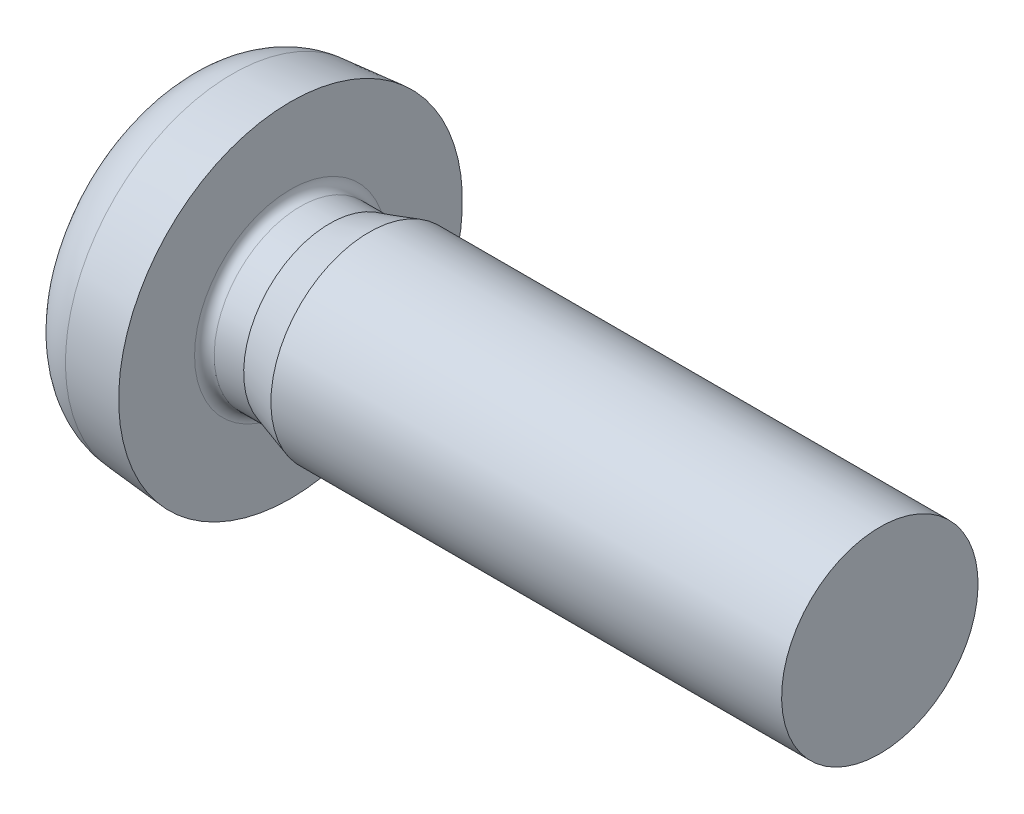
ISO-10303-21;
HEADER;
FILE_DESCRIPTION(('STEP AP214'),'2;1');
FILE_NAME('part.step','',(''),(''),'','','');
FILE_SCHEMA(('AUTOMOTIVE_DESIGN { 1 0 10303 214 1 1 1 1 }'));
ENDSEC;
DATA;
#1=APPLICATION_CONTEXT('core data for automotive mechanical design processes');
#2=APPLICATION_PROTOCOL_DEFINITION('international standard','automotive_design',2000,#1);
#3=PRODUCT_CONTEXT('',#1,'mechanical');
#4=PRODUCT('Part','Part','',(#3));
#5=PRODUCT_RELATED_PRODUCT_CATEGORY('part','',(#4));
#6=PRODUCT_DEFINITION_FORMATION('','',#4);
#7=PRODUCT_DEFINITION_CONTEXT('part definition',#1,'design');
#8=PRODUCT_DEFINITION('design','',#6,#7);
#9=PRODUCT_DEFINITION_SHAPE('','',#8);
#10=(LENGTH_UNIT() NAMED_UNIT(*) SI_UNIT(.MILLI.,.METRE.));
#11=(NAMED_UNIT(*) PLANE_ANGLE_UNIT() SI_UNIT($,.RADIAN.));
#12=(NAMED_UNIT(*) SI_UNIT($,.STERADIAN.) SOLID_ANGLE_UNIT());
#13=UNCERTAINTY_MEASURE_WITH_UNIT(LENGTH_MEASURE(1.E-05),#10,'distance_accuracy_value','');
#14=(GEOMETRIC_REPRESENTATION_CONTEXT(3) GLOBAL_UNCERTAINTY_ASSIGNED_CONTEXT((#13)) GLOBAL_UNIT_ASSIGNED_CONTEXT((#10,
#11,#12)) REPRESENTATION_CONTEXT('',''));
#15=CARTESIAN_POINT('',(0.,0.,0.));
#16=DIRECTION('',(0.,0.,1.));
#17=DIRECTION('',(1.,0.,0.));
#18=AXIS2_PLACEMENT_3D('',#15,#16,#17);
#19=CARTESIAN_POINT('',(-0.3,0.4,-0.23333333333333));
#20=DIRECTION('',(-1.,0.,0.));
#21=DIRECTION('',(0.,0.,1.));
#22=AXIS2_PLACEMENT_3D('',#19,#20,#21);
#23=PLANE('',#22);
#24=CARTESIAN_POINT('',(-0.3,0.,0.));
#25=DIRECTION('',(-1.,0.,0.));
#26=DIRECTION('',(0.,0.,1.));
#27=AXIS2_PLACEMENT_3D('',#24,#25,#26);
#28=CIRCLE('',#27,0.41489922506576);
#29=CARTESIAN_POINT('',(-0.300000000000007,0.110187871202621,0.400000000000005));
#30=VERTEX_POINT('',#29);
#31=CARTESIAN_POINT('',(-0.3,0.233333333333331,0.343069850782206));
#32=VERTEX_POINT('',#31);
#33=EDGE_CURVE('E434',#30,#32,#28,.T.);
#34=ORIENTED_EDGE('',*,*,#33,.F.);
#35=CARTESIAN_POINT('',(-0.299999999999999,0.233333333333331,0.400000000000001));
#36=DIRECTION('',(0.,-1.,0.));
#37=VECTOR('',#36,1.);
#38=LINE('',#35,#37);
#39=CARTESIAN_POINT('',(-0.3,0.233333333333332,0.4));
#40=VERTEX_POINT('',#39);
#41=EDGE_CURVE('E436',#40,#30,#38,.T.);
#42=ORIENTED_EDGE('',*,*,#41,.F.);
#43=CARTESIAN_POINT('',(-0.3,0.233333333333331,0.34306985078241));
#44=DIRECTION('',(0.,0.,1.));
#45=VECTOR('',#44,1.);
#46=LINE('',#43,#45);
#47=EDGE_CURVE('E437',#32,#40,#46,.T.);
#48=ORIENTED_EDGE('',*,*,#47,.F.);
#49=EDGE_LOOP('',(#34,#42,#48));
#50=FACE_BOUND('',#49,.T.);
#51=ADVANCED_FACE('F17',(#50),#23,.T.);
#52=CARTESIAN_POINT('',(-0.300000000000013,0.343069850782208,0.23333333333333));
#53=VERTEX_POINT('',#52);
#54=CARTESIAN_POINT('',(-0.3,0.400000000038284,0.11018787106366));
#55=VERTEX_POINT('',#54);
#56=EDGE_CURVE('E641',#53,#55,#28,.T.);
#57=ORIENTED_EDGE('',*,*,#56,.F.);
#58=CARTESIAN_POINT('',(-0.3,0.4,0.23333333333333));
#59=DIRECTION('',(0.,-1.,0.));
#60=VECTOR('',#59,1.);
#61=LINE('',#58,#60);
#62=CARTESIAN_POINT('',(-0.3,0.4,0.23333333333333));
#63=VERTEX_POINT('',#62);
#64=EDGE_CURVE('E533',#63,#53,#61,.T.);
#65=ORIENTED_EDGE('',*,*,#64,.F.);
#66=CARTESIAN_POINT('',(-0.300000000000001,0.400000000000001,0.110187871053114));
#67=DIRECTION('',(0.,0.,1.));
#68=VECTOR('',#67,1.);
#69=LINE('',#66,#68);
#70=EDGE_CURVE('E548',#55,#63,#69,.T.);
#71=ORIENTED_EDGE('',*,*,#70,.F.);
#72=EDGE_LOOP('',(#57,#65,#71));
#73=FACE_BOUND('',#72,.T.);
#74=ADVANCED_FACE('F424',(#73),#23,.T.);
#75=CARTESIAN_POINT('',(-0.300000000037748,0.400000000026424,-0.110187871119148));
#76=VERTEX_POINT('',#75);
#77=CARTESIAN_POINT('',(-0.3,0.343069850782207,-0.23333333333333));
#78=VERTEX_POINT('',#77);
#79=EDGE_CURVE('E642',#76,#78,#28,.T.);
#80=ORIENTED_EDGE('',*,*,#79,.F.);
#81=CARTESIAN_POINT('',(-0.300000000000001,0.400000000000001,-0.23333333333333));
#82=DIRECTION('',(0.,0.,1.));
#83=VECTOR('',#82,1.);
#84=LINE('',#81,#83);
#85=CARTESIAN_POINT('',(-0.3,0.4,-0.23333333333333));
#86=VERTEX_POINT('',#85);
#87=EDGE_CURVE('E541',#86,#76,#84,.T.);
#88=ORIENTED_EDGE('',*,*,#87,.F.);
#89=CARTESIAN_POINT('',(-0.3,0.343069850782207,-0.23333333333333));
#90=DIRECTION('',(0.,1.,0.));
#91=VECTOR('',#90,1.);
#92=LINE('',#89,#91);
#93=EDGE_CURVE('E317',#78,#86,#92,.T.);
#94=ORIENTED_EDGE('',*,*,#93,.F.);
#95=EDGE_LOOP('',(#80,#88,#94));
#96=FACE_BOUND('',#95,.T.);
#97=ADVANCED_FACE('F430',(#96),#23,.T.);
#98=CARTESIAN_POINT('',(-0.3,0.233333333333329,-0.343069850782208));
#99=VERTEX_POINT('',#98);
#100=CARTESIAN_POINT('',(-0.3,0.110187871202632,-0.4));
#101=VERTEX_POINT('',#100);
#102=EDGE_CURVE('E654',#99,#101,#28,.T.);
#103=ORIENTED_EDGE('',*,*,#102,.F.);
#104=CARTESIAN_POINT('',(-0.3,0.233333333333329,-0.400000000000001));
#105=DIRECTION('',(0.,0.,1.));
#106=VECTOR('',#105,1.);
#107=LINE('',#104,#106);
#108=CARTESIAN_POINT('',(-0.3,0.233333333333329,-0.4));
#109=VERTEX_POINT('',#108);
#110=EDGE_CURVE('E472',#109,#99,#107,.T.);
#111=ORIENTED_EDGE('',*,*,#110,.F.);
#112=CARTESIAN_POINT('',(-0.300000000000001,0.110187871202633,-0.400000000000002));
#113=DIRECTION('',(0.,1.,0.));
#114=VECTOR('',#113,1.);
#115=LINE('',#112,#114);
#116=EDGE_CURVE('E176',#101,#109,#115,.T.);
#117=ORIENTED_EDGE('',*,*,#116,.F.);
#118=EDGE_LOOP('',(#103,#111,#117));
#119=FACE_BOUND('',#118,.T.);
#120=ADVANCED_FACE('F659',(#119),#23,.T.);
#121=CARTESIAN_POINT('',(-0.3,-0.110187871202431,-0.400000000000056));
#122=VERTEX_POINT('',#121);
#123=CARTESIAN_POINT('',(-0.30000000000002,-0.233333333333332,-0.343069850782208));
#124=VERTEX_POINT('',#123);
#125=EDGE_CURVE('E591',#122,#124,#28,.T.);
#126=ORIENTED_EDGE('',*,*,#125,.F.);
#127=CARTESIAN_POINT('',(-0.300000000000001,-0.233333333333331,-0.400000000000001));
#128=DIRECTION('',(0.,1.,0.));
#129=VECTOR('',#128,1.);
#130=LINE('',#127,#129);
#131=CARTESIAN_POINT('',(-0.3,-0.233333333333332,-0.4));
#132=VERTEX_POINT('',#131);
#133=EDGE_CURVE('E589',#132,#122,#130,.T.);
#134=ORIENTED_EDGE('',*,*,#133,.F.);
#135=CARTESIAN_POINT('',(-0.3,-0.233333333333331,-0.343069850782409));
#136=DIRECTION('',(0.,0.,-1.));
#137=VECTOR('',#136,1.);
#138=LINE('',#135,#137);
#139=EDGE_CURVE('E177',#124,#132,#138,.T.);
#140=ORIENTED_EDGE('',*,*,#139,.F.);
#141=EDGE_LOOP('',(#126,#134,#140));
#142=FACE_BOUND('',#141,.T.);
#143=ADVANCED_FACE('F590',(#142),#23,.T.);
#144=CARTESIAN_POINT('',(-0.3,-0.343069850782207,-0.23333333333333));
#145=VERTEX_POINT('',#144);
#146=CARTESIAN_POINT('',(-0.300000000000011,-0.400000000000008,-0.11018787120261));
#147=VERTEX_POINT('',#146);
#148=EDGE_CURVE('E638',#145,#147,#28,.T.);
#149=ORIENTED_EDGE('',*,*,#148,.F.);
#150=CARTESIAN_POINT('',(-0.3,-0.4,-0.23333333333333));
#151=DIRECTION('',(0.,1.,0.));
#152=VECTOR('',#151,1.);
#153=LINE('',#150,#152);
#154=CARTESIAN_POINT('',(-0.3,-0.4,-0.23333333333333));
#155=VERTEX_POINT('',#154);
#156=EDGE_CURVE('E553',#155,#145,#153,.T.);
#157=ORIENTED_EDGE('',*,*,#156,.F.);
#158=CARTESIAN_POINT('',(-0.300000000000001,-0.400000000000001,-0.110187871053114));
#159=DIRECTION('',(0.,0.,-1.));
#160=VECTOR('',#159,1.);
#161=LINE('',#158,#160);
#162=EDGE_CURVE('E529',#147,#155,#161,.T.);
#163=ORIENTED_EDGE('',*,*,#162,.F.);
#164=EDGE_LOOP('',(#149,#157,#163));
#165=FACE_BOUND('',#164,.T.);
#166=ADVANCED_FACE('F750',(#165),#23,.T.);
#167=CARTESIAN_POINT('',(-0.3,-0.400000000000057,0.11018787120243));
#168=VERTEX_POINT('',#167);
#169=CARTESIAN_POINT('',(-0.30000000000002,-0.343069850782209,0.23333333333333));
#170=VERTEX_POINT('',#169);
#171=EDGE_CURVE('E619',#168,#170,#28,.T.);
#172=ORIENTED_EDGE('',*,*,#171,.F.);
#173=CARTESIAN_POINT('',(-0.300000000000001,-0.400000000000001,0.23333333333333));
#174=DIRECTION('',(0.,0.,-1.));
#175=VECTOR('',#174,1.);
#176=LINE('',#173,#175);
#177=CARTESIAN_POINT('',(-0.3,-0.4,0.23333333333333));
#178=VERTEX_POINT('',#177);
#179=EDGE_CURVE('E525',#178,#168,#176,.T.);
#180=ORIENTED_EDGE('',*,*,#179,.F.);
#181=CARTESIAN_POINT('',(-0.3,-0.343069850782207,0.23333333333333));
#182=DIRECTION('',(0.,-1.,0.));
#183=VECTOR('',#182,1.);
#184=LINE('',#181,#183);
#185=EDGE_CURVE('E535',#170,#178,#184,.T.);
#186=ORIENTED_EDGE('',*,*,#185,.F.);
#187=EDGE_LOOP('',(#172,#180,#186));
#188=FACE_BOUND('',#187,.T.);
#189=ADVANCED_FACE('F342',(#188),#23,.T.);
#190=CARTESIAN_POINT('',(0.271428571428572,0.,0.23333333333333));
#191=DIRECTION('',(0.,0.,1.));
#192=DIRECTION('',(1.,0.,0.));
#193=AXIS2_PLACEMENT_3D('',#190,#191,#192);
#194=PLANE('',#193);
#195=ORIENTED_EDGE('',*,*,#64,.T.);
#196=CARTESIAN_POINT('',(-0.2997,0.343038108403994,0.23333333333333));
#197=CARTESIAN_POINT('',(-0.426200518487948,0.356413169292468,0.23333333333333));
#198=CARTESIAN_POINT('',(-0.552724537571043,0.369562838851567,0.23333333333333));
#199=CARTESIAN_POINT('',(-0.805808804996358,0.395504275504335,0.23333333333333));
#200=CARTESIAN_POINT('',(-0.932369053194846,0.408296043998559,0.23333333333333));
#201=CARTESIAN_POINT('',(-1.13532721935039,0.428595006281568,0.23333333333333));
#202=CARTESIAN_POINT('',(-1.21171672944914,0.436186419234913,0.23333333333333));
#203=CARTESIAN_POINT('',(-1.28810992623331,0.44373980396504,0.23333333333333));
#204=B_SPLINE_CURVE_WITH_KNOTS('',3,(#196,#197,#198,#199,#200,#201,#202,#203),.UNSPECIFIED.,.F.,
.F.,(4,2,2,4),(0.,0.381616218749478,0.763230943932751,0.993528205938742),.UNSPECIFIED.);
#205=CARTESIAN_POINT('',(-1.27214147961395,0.442160764736997,0.23333333333333));
#206=VERTEX_POINT('',#205);
#207=EDGE_CURVE('E649',#53,#206,#204,.T.);
#208=ORIENTED_EDGE('',*,*,#207,.T.);
#209=CARTESIAN_POINT('',(3.19999999999751,0.,0.23333333333333));
#210=DIRECTION('',(0.,0.,1.));
#211=DIRECTION('',(1.,0.,0.));
#212=AXIS2_PLACEMENT_3D('',#209,#210,#211);
#213=CIRCLE('',#212,4.49394654569168);
#214=CARTESIAN_POINT('',(-1.17792712457823,1.01454898720476,0.23333333333333));
#215=VERTEX_POINT('',#214);
#216=EDGE_CURVE('E492',#215,#206,#213,.T.);
#217=ORIENTED_EDGE('',*,*,#216,.F.);
#218=DIRECTION('',(-0.81923192051904,0.573462344363328,0.));
#219=VECTOR('',#218,1.);
#220=CARTESIAN_POINT('',(-0.3,0.4,0.23333333333333));
#221=LINE('',#220,#219);
#222=EDGE_CURVE('E556',#63,#215,#221,.T.);
#223=ORIENTED_EDGE('',*,*,#222,.F.);
#224=EDGE_LOOP('',(#195,#208,#217,#223));
#225=FACE_BOUND('',#224,.T.);
#226=ADVANCED_FACE('F661',(#225),#194,.F.);
#227=CARTESIAN_POINT('',(0.271428571428572,0.,-0.23333333333333));
#228=DIRECTION('',(0.,0.,-1.));
#229=DIRECTION('',(-1.,0.,0.));
#230=AXIS2_PLACEMENT_3D('',#227,#228,#229);
#231=PLANE('',#230);
#232=CARTESIAN_POINT('',(3.19999999999751,0.,-0.23333333333333));
#233=DIRECTION('',(0.,0.,-1.));
#234=DIRECTION('',(-1.,0.,0.));
#235=AXIS2_PLACEMENT_3D('',#232,#233,#234);
#236=CIRCLE('',#235,4.49394654569168);
#237=CARTESIAN_POINT('',(-1.27214147961393,0.442160764737084,-0.23333333333333));
#238=VERTEX_POINT('',#237);
#239=CARTESIAN_POINT('',(-1.17792712457823,1.01454898720476,-0.23333333333333));
#240=VERTEX_POINT('',#239);
#241=EDGE_CURVE('E499',#238,#240,#236,.T.);
#242=ORIENTED_EDGE('',*,*,#241,.F.);
#243=CARTESIAN_POINT('',(-1.28810992623331,0.44373980396504,-0.23333333333333));
#244=CARTESIAN_POINT('',(-1.20571743140864,0.435594808395287,-0.23333333333333));
#245=CARTESIAN_POINT('',(-1.12332951598812,0.427403221854397,-0.23333333333333));
#246=CARTESIAN_POINT('',(-0.958565391565636,0.410905577220105,-0.23333333333333));
#247=CARTESIAN_POINT('',(-0.876189182530653,0.402599519456286,-0.23333333333333));
#248=CARTESIAN_POINT('',(-0.711450476951214,0.385851589291033,-0.23333333333333));
#249=CARTESIAN_POINT('',(-0.629087980417993,0.37740971677886,-0.23333333333333));
#250=CARTESIAN_POINT('',(-0.464380151721125,0.360357960412237,-0.23333333333333));
#251=CARTESIAN_POINT('',(-0.38203481960775,0.351748076072497,-0.23333333333333));
#252=CARTESIAN_POINT('',(-0.299699999999289,0.343038108411188,-0.23333333333333));
#253=B_SPLINE_CURVE_WITH_KNOTS('',3,(#243,#244,#245,#246,#247,#248,#249,#250,#251,#252),
.UNSPECIFIED.,.F.,.F.,(4,2,2,2,4),(0.,0.248382344578916,0.496763974168754,0.7451458062906,
0.99352835595135),.UNSPECIFIED.);
#254=EDGE_CURVE('E278',#238,#78,#253,.T.);
#255=ORIENTED_EDGE('',*,*,#254,.T.);
#256=ORIENTED_EDGE('',*,*,#93,.T.);
#257=DIRECTION('',(-0.81923192051904,0.573462344363328,0.));
#258=VECTOR('',#257,1.);
#259=CARTESIAN_POINT('',(-0.3,0.4,-0.23333333333333));
#260=LINE('',#259,#258);
#261=EDGE_CURVE('E557',#86,#240,#260,.T.);
#262=ORIENTED_EDGE('',*,*,#261,.T.);
#263=EDGE_LOOP('',(#242,#255,#256,#262));
#264=FACE_BOUND('',#263,.T.);
#265=ADVANCED_FACE('F289',(#264),#231,.F.);
#266=CARTESIAN_POINT('',(3.19999999999751,0.,0.));
#267=DIRECTION('',(-1.,0.,0.));
#268=DIRECTION('',(0.,1.,0.));
#269=AXIS2_PLACEMENT_3D('',#266,#267,#268);
#270=SPHERICAL_SURFACE('',#269,4.49999999999762);
#271=CARTESIAN_POINT('',(3.19999999999751,0.23333333333333,0.));
#272=DIRECTION('',(0.,1.,0.));
#273=DIRECTION('',(0.,0.,1.));
#274=AXIS2_PLACEMENT_3D('',#271,#272,#273);
#275=CIRCLE('',#274,4.49394654569168);
#276=CARTESIAN_POINT('',(-1.17792712457823,0.233333333333327,-1.01454898720476));
#277=VERTEX_POINT('',#276);
#278=CARTESIAN_POINT('',(-1.27214147961395,0.233333333333329,-0.442160764736998));
#279=VERTEX_POINT('',#278);
#280=EDGE_CURVE('E598',#277,#279,#275,.T.);
#281=ORIENTED_EDGE('',*,*,#280,.T.);
#282=CARTESIAN_POINT('',(-1.27214147961395,0.,0.));
#283=DIRECTION('',(1.,0.,0.));
#284=DIRECTION('',(0.,0.,-1.));
#285=AXIS2_PLACEMENT_3D('',#282,#283,#284);
#286=CIRCLE('',#285,0.499950583875296);
#287=EDGE_CURVE('E644',#279,#238,#286,.T.);
#288=ORIENTED_EDGE('',*,*,#287,.T.);
#289=ORIENTED_EDGE('',*,*,#241,.T.);
#290=CARTESIAN_POINT('',(2.23691275167617,-1.37583892617332,0.));
#291=DIRECTION('',(0.573462344363328,0.819231920519041,0.));
#292=DIRECTION('',(-0.81923192051904,0.573462344363328,0.));
#293=AXIS2_PLACEMENT_3D('',#290,#291,#292);
#294=CIRCLE('',#293,4.17486888432747);
#295=EDGE_CURVE('E489',#240,#215,#294,.T.);
#296=ORIENTED_EDGE('',*,*,#295,.T.);
#297=ORIENTED_EDGE('',*,*,#216,.T.);
#298=CARTESIAN_POINT('',(-1.27214147961393,0.233333333333332,0.442160764737084));
#299=VERTEX_POINT('',#298);
#300=EDGE_CURVE('E622',#206,#299,#286,.T.);
#301=ORIENTED_EDGE('',*,*,#300,.T.);
#302=CARTESIAN_POINT('',(-1.17792712457823,0.233333333333334,1.01454898720476));
#303=VERTEX_POINT('',#302);
#304=EDGE_CURVE('E602',#299,#303,#275,.T.);
#305=ORIENTED_EDGE('',*,*,#304,.T.);
#306=CARTESIAN_POINT('',(2.23691275167617,0.,-1.37583892617332));
#307=DIRECTION('',(0.573462344363328,0.,0.819231920519041));
#308=DIRECTION('',(0.819231920519041,0.,-0.573462344363328));
#309=AXIS2_PLACEMENT_3D('',#306,#307,#308);
#310=CIRCLE('',#309,4.17486888432747);
#311=CARTESIAN_POINT('',(-1.17792712457823,-0.233333333333327,1.01454898720476));
#312=VERTEX_POINT('',#311);
#313=EDGE_CURVE('E486',#303,#312,#310,.T.);
#314=ORIENTED_EDGE('',*,*,#313,.T.);
#315=CARTESIAN_POINT('',(3.19999999999751,-0.23333333333333,0.));
#316=DIRECTION('',(0.,-1.,0.));
#317=DIRECTION('',(0.,0.,-1.));
#318=AXIS2_PLACEMENT_3D('',#315,#316,#317);
#319=CIRCLE('',#318,4.49394654569168);
#320=CARTESIAN_POINT('',(-1.27214147961403,-0.233333333333329,0.442160764736266));
#321=VERTEX_POINT('',#320);
#322=EDGE_CURVE('E601',#312,#321,#319,.T.);
#323=ORIENTED_EDGE('',*,*,#322,.T.);
#324=CARTESIAN_POINT('',(-1.27214147961395,-0.442160764736998,0.23333333333333));
#325=VERTEX_POINT('',#324);
#326=EDGE_CURVE('E35',#321,#325,#286,.T.);
#327=ORIENTED_EDGE('',*,*,#326,.T.);
#328=CARTESIAN_POINT('',(-1.17792712457823,-1.01454898720476,0.23333333333333));
#329=VERTEX_POINT('',#328);
#330=EDGE_CURVE('E495',#325,#329,#213,.T.);
#331=ORIENTED_EDGE('',*,*,#330,.T.);
#332=CARTESIAN_POINT('',(2.23691275167617,1.37583892617332,0.));
#333=DIRECTION('',(0.573462344363328,-0.819231920519041,0.));
#334=DIRECTION('',(0.81923192051904,0.573462344363328,0.));
#335=AXIS2_PLACEMENT_3D('',#332,#333,#334);
#336=CIRCLE('',#335,4.17486888432747);
#337=CARTESIAN_POINT('',(-1.17792712457823,-1.01454898720476,-0.23333333333333));
#338=VERTEX_POINT('',#337);
#339=EDGE_CURVE('E500',#329,#338,#336,.T.);
#340=ORIENTED_EDGE('',*,*,#339,.T.);
#341=CARTESIAN_POINT('',(-1.27214147961393,-0.442160764737084,-0.23333333333333));
#342=VERTEX_POINT('',#341);
#343=EDGE_CURVE('E496',#338,#342,#236,.T.);
#344=ORIENTED_EDGE('',*,*,#343,.T.);
#345=CARTESIAN_POINT('',(-1.27214147961395,-0.233333333333332,-0.442160764736996));
#346=VERTEX_POINT('',#345);
#347=EDGE_CURVE('E600',#342,#346,#286,.T.);
#348=ORIENTED_EDGE('',*,*,#347,.T.);
#349=CARTESIAN_POINT('',(-1.17792712457823,-0.233333333333334,-1.01454898720476));
#350=VERTEX_POINT('',#349);
#351=EDGE_CURVE('E186',#346,#350,#319,.T.);
#352=ORIENTED_EDGE('',*,*,#351,.T.);
#353=CARTESIAN_POINT('',(2.23691275167617,0.,1.37583892617332));
#354=DIRECTION('',(0.573462344363329,0.,-0.819231920519041));
#355=DIRECTION('',(-0.819231920519041,0.,-0.573462344363329));
#356=AXIS2_PLACEMENT_3D('',#353,#354,#355);
#357=CIRCLE('',#356,4.17486888432747);
#358=EDGE_CURVE('E27',#350,#277,#357,.T.);
#359=ORIENTED_EDGE('',*,*,#358,.T.);
#360=EDGE_LOOP('',(#281,#288,#289,#296,#297,#301,#305,#314,#323,#327,#331,#340,#344,#348,#352,#359));
#361=FACE_BOUND('',#360,.T.);
#362=CARTESIAN_POINT('',(-1.1171858241993,0.,0.));
#363=DIRECTION('',(-1.,0.,0.));
#364=DIRECTION('',(0.,-1.,0.));
#365=AXIS2_PLACEMENT_3D('',#362,#363,#364);
#366=CIRCLE('',#365,1.2696088213827);
#367=CARTESIAN_POINT('',(-1.1171858241993,-1.2696088213827,0.));
#368=VERTEX_POINT('',#367);
#369=EDGE_CURVE('E503',#368,#368,#366,.T.);
#370=ORIENTED_EDGE('',*,*,#369,.T.);
#371=EDGE_LOOP('',(#370));
#372=FACE_BOUND('',#371,.T.);
#373=ADVANCED_FACE('F19',(#361,#372),#270,.T.);
#374=CARTESIAN_POINT('',(-0.541561047639255,0.,0.));
#375=DIRECTION('',(-1.,0.,0.));
#376=DIRECTION('',(0.,-1.,0.));
#377=AXIS2_PLACEMENT_3D('',#374,#375,#376);
#378=TOROIDAL_SURFACE('',#377,1.10032764519818,0.600000000000179);
#379=ORIENTED_EDGE('',*,*,#369,.F.);
#380=EDGE_LOOP('',(#379));
#381=FACE_BOUND('',#380,.T.);
#382=CARTESIAN_POINT('',(-0.593854493287836,0.,0.));
#383=DIRECTION('',(-1.,0.,0.));
#384=DIRECTION('',(0.,-1.,0.));
#385=AXIS2_PLACEMENT_3D('',#382,#383,#384);
#386=CIRCLE('',#385,1.69804446405341);
#387=CARTESIAN_POINT('',(-0.593854493287836,-1.69804446405342,0.));
#388=VERTEX_POINT('',#387);
#389=EDGE_CURVE('E506',#388,#388,#386,.T.);
#390=ORIENTED_EDGE('',*,*,#389,.T.);
#391=EDGE_LOOP('',(#390));
#392=FACE_BOUND('',#391,.T.);
#393=ADVANCED_FACE('F733',(#381,#392),#378,.T.);
#394=CARTESIAN_POINT('',(0.,0.,0.));
#395=DIRECTION('',(1.,0.,0.));
#396=DIRECTION('',(0.,1.,0.));
#397=AXIS2_PLACEMENT_3D('',#394,#395,#396);
#398=CONICAL_SURFACE('',#397,1.75,0.0872664625996655);
#399=ORIENTED_EDGE('',*,*,#389,.F.);
#400=EDGE_LOOP('',(#399));
#401=FACE_BOUND('',#400,.T.);
#402=CARTESIAN_POINT('',(0.,0.,0.));
#403=DIRECTION('',(-1.,0.,0.));
#404=DIRECTION('',(0.,-1.,0.));
#405=AXIS2_PLACEMENT_3D('',#402,#403,#404);
#406=CIRCLE('',#405,1.75);
#407=CARTESIAN_POINT('',(0.,-1.75,0.));
#408=VERTEX_POINT('',#407);
#409=EDGE_CURVE('E509',#408,#408,#406,.T.);
#410=ORIENTED_EDGE('',*,*,#409,.T.);
#411=EDGE_LOOP('',(#410));
#412=FACE_BOUND('',#411,.T.);
#413=ADVANCED_FACE('F756',(#401,#412),#398,.T.);
#414=CARTESIAN_POINT('',(0.,1.75,0.));
#415=DIRECTION('',(-1.,0.,0.));
#416=DIRECTION('',(0.,-1.,0.));
#417=AXIS2_PLACEMENT_3D('',#414,#415,#416);
#418=PLANE('',#417);
#419=ORIENTED_EDGE('',*,*,#409,.F.);
#420=EDGE_LOOP('',(#419));
#421=FACE_BOUND('',#420,.T.);
#422=CARTESIAN_POINT('',(0.,0.,0.));
#423=DIRECTION('',(-1.,0.,0.));
#424=DIRECTION('',(0.,-1.,0.));
#425=AXIS2_PLACEMENT_3D('',#422,#423,#424);
#426=CIRCLE('',#425,0.977250000000021);
#427=CARTESIAN_POINT('',(0.,-0.977250000000022,0.));
#428=VERTEX_POINT('',#427);
#429=EDGE_CURVE('E512',#428,#428,#426,.T.);
#430=ORIENTED_EDGE('',*,*,#429,.T.);
#431=EDGE_LOOP('',(#430));
#432=FACE_BOUND('',#431,.T.);
#433=ADVANCED_FACE('F763',(#421,#432),#418,.F.);
#434=CARTESIAN_POINT('',(0.0999999999999905,0.,0.));
#435=DIRECTION('',(-1.,0.,0.));
#436=DIRECTION('',(0.,-1.,0.));
#437=AXIS2_PLACEMENT_3D('',#434,#435,#436);
#438=TOROIDAL_SURFACE('',#437,0.977250000000011,0.0999999999999904);
#439=ORIENTED_EDGE('',*,*,#429,.F.);
#440=EDGE_LOOP('',(#439));
#441=FACE_BOUND('',#440,.T.);
#442=CARTESIAN_POINT('',(0.0999999999999977,0.,0.));
#443=DIRECTION('',(-1.,0.,0.));
#444=DIRECTION('',(0.,-1.,0.));
#445=AXIS2_PLACEMENT_3D('',#442,#443,#444);
#446=CIRCLE('',#445,0.877250000000021);
#447=CARTESIAN_POINT('',(0.0999999999999978,-0.877250000000022,0.));
#448=VERTEX_POINT('',#447);
#449=EDGE_CURVE('E515',#448,#448,#446,.T.);
#450=ORIENTED_EDGE('',*,*,#449,.T.);
#451=EDGE_LOOP('',(#450));
#452=FACE_BOUND('',#451,.T.);
#453=ADVANCED_FACE('F771',(#441,#452),#438,.F.);
#454=CARTESIAN_POINT('',(6.,0.,0.));
#455=DIRECTION('',(-1.,0.,0.));
#456=DIRECTION('',(0.,-1.,0.));
#457=AXIS2_PLACEMENT_3D('',#454,#455,#456);
#458=CYLINDRICAL_SURFACE('',#457,0.877250000000016);
#459=ORIENTED_EDGE('',*,*,#449,.F.);
#460=EDGE_LOOP('',(#459));
#461=FACE_BOUND('',#460,.T.);
#462=CARTESIAN_POINT('',(0.40000000000002,0.,0.));
#463=DIRECTION('',(-1.,0.,0.));
#464=DIRECTION('',(0.,-1.,0.));
#465=AXIS2_PLACEMENT_3D('',#462,#463,#464);
#466=CIRCLE('',#465,0.877250000000011);
#467=CARTESIAN_POINT('',(0.40000000000002,-0.877250000000012,0.));
#468=VERTEX_POINT('',#467);
#469=EDGE_CURVE('E518',#468,#468,#466,.T.);
#470=ORIENTED_EDGE('',*,*,#469,.T.);
#471=EDGE_LOOP('',(#470));
#472=FACE_BOUND('',#471,.T.);
#473=ADVANCED_FACE('F779',(#461,#472),#458,.T.);
#474=CARTESIAN_POINT('',(0.8,0.,0.));
#475=DIRECTION('',(1.,0.,0.));
#476=DIRECTION('',(0.,1.,0.));
#477=AXIS2_PLACEMENT_3D('',#474,#475,#476);
#478=CONICAL_SURFACE('',#477,1.,0.297752138542782);
#479=ORIENTED_EDGE('',*,*,#469,.F.);
#480=EDGE_LOOP('',(#479));
#481=FACE_BOUND('',#480,.T.);
#482=CARTESIAN_POINT('',(0.8,0.,0.));
#483=DIRECTION('',(-1.,0.,0.));
#484=DIRECTION('',(0.,-1.,0.));
#485=AXIS2_PLACEMENT_3D('',#482,#483,#484);
#486=CIRCLE('',#485,1.);
#487=CARTESIAN_POINT('',(0.8,-1.,0.));
#488=VERTEX_POINT('',#487);
#489=EDGE_CURVE('E520',#488,#488,#486,.T.);
#490=ORIENTED_EDGE('',*,*,#489,.T.);
#491=EDGE_LOOP('',(#490));
#492=FACE_BOUND('',#491,.T.);
#493=ADVANCED_FACE('F787',(#481,#492),#478,.T.);
#494=CARTESIAN_POINT('',(6.,0.,0.));
#495=DIRECTION('',(-1.,0.,0.));
#496=DIRECTION('',(0.,-1.,0.));
#497=AXIS2_PLACEMENT_3D('',#494,#495,#496);
#498=CYLINDRICAL_SURFACE('',#497,1.);
#499=ORIENTED_EDGE('',*,*,#489,.F.);
#500=EDGE_LOOP('',(#499));
#501=FACE_BOUND('',#500,.T.);
#502=CARTESIAN_POINT('',(6.,0.,0.));
#503=DIRECTION('',(-1.,0.,0.));
#504=DIRECTION('',(0.,-1.,0.));
#505=AXIS2_PLACEMENT_3D('',#502,#503,#504);
#506=CIRCLE('',#505,1.);
#507=CARTESIAN_POINT('',(6.,-1.,0.));
#508=VERTEX_POINT('',#507);
#509=EDGE_CURVE('E331',#508,#508,#506,.T.);
#510=ORIENTED_EDGE('',*,*,#509,.T.);
#511=EDGE_LOOP('',(#510));
#512=FACE_BOUND('',#511,.T.);
#513=ADVANCED_FACE('F795',(#501,#512),#498,.T.);
#514=CARTESIAN_POINT('',(6.,1.,0.));
#515=DIRECTION('',(-1.,0.,0.));
#516=DIRECTION('',(0.,-1.,0.));
#517=AXIS2_PLACEMENT_3D('',#514,#515,#516);
#518=PLANE('',#517);
#519=ORIENTED_EDGE('',*,*,#509,.F.);
#520=EDGE_LOOP('',(#519));
#521=FACE_BOUND('',#520,.T.);
#522=ADVANCED_FACE('F726',(#521),#518,.F.);
#523=CARTESIAN_POINT('',(-1.3,1.1,-0.23333333333333));
#524=DIRECTION('',(0.573462344363328,0.819231920519041,0.));
#525=DIRECTION('',(-0.81923192051904,0.573462344363328,0.));
#526=AXIS2_PLACEMENT_3D('',#523,#524,#525);
#527=PLANE('',#526);
#528=ORIENTED_EDGE('',*,*,#87,.T.);
#529=CARTESIAN_POINT('',(0.205241374074472,0.0463310381478698,0.));
#530=DIRECTION('',(0.573462344363328,0.819231920519041,0.));
#531=DIRECTION('',(-0.819231920519041,0.573462344363328,0.));
#532=AXIS2_PLACEMENT_3D('',#529,#530,#531);
#533=ELLIPSE('',#532,0.64641791415536,0.367789621693797);
#534=EDGE_CURVE('E643',#76,#55,#533,.T.);
#535=ORIENTED_EDGE('',*,*,#534,.T.);
#536=ORIENTED_EDGE('',*,*,#70,.T.);
#537=ORIENTED_EDGE('',*,*,#222,.T.);
#538=ORIENTED_EDGE('',*,*,#295,.F.);
#539=ORIENTED_EDGE('',*,*,#261,.F.);
#540=EDGE_LOOP('',(#528,#535,#536,#537,#538,#539));
#541=FACE_BOUND('',#540,.T.);
#542=ADVANCED_FACE('F343',(#541),#527,.F.);
#543=ORIENTED_EDGE('',*,*,#330,.F.);
#544=CARTESIAN_POINT('',(-1.28810992623331,-0.44373980396504,0.23333333333333));
#545=CARTESIAN_POINT('',(-1.20571743140864,-0.435594808395286,0.23333333333333));
#546=CARTESIAN_POINT('',(-1.12332951598812,-0.427403221854397,0.23333333333333));
#547=CARTESIAN_POINT('',(-0.958565391565636,-0.410905577220105,0.23333333333333));
#548=CARTESIAN_POINT('',(-0.876189182530653,-0.402599519456286,0.23333333333333));
#549=CARTESIAN_POINT('',(-0.711450476951214,-0.385851589291033,0.23333333333333));
#550=CARTESIAN_POINT('',(-0.629087980417993,-0.37740971677886,0.23333333333333));
#551=CARTESIAN_POINT('',(-0.464380151721125,-0.360357960412237,0.23333333333333));
#552=CARTESIAN_POINT('',(-0.38203481960775,-0.351748076072497,0.23333333333333));
#553=CARTESIAN_POINT('',(-0.299699999999289,-0.343038108411188,0.23333333333333));
#554=B_SPLINE_CURVE_WITH_KNOTS('',3,(#544,#545,#546,#547,#548,#549,#550,#551,#552,#553),
.UNSPECIFIED.,.F.,.F.,(4,2,2,2,4),(0.,0.248382344578916,0.496763974168754,0.7451458062906,
0.99352835595135),.UNSPECIFIED.);
#555=EDGE_CURVE('E439',#325,#170,#554,.T.);
#556=ORIENTED_EDGE('',*,*,#555,.T.);
#557=ORIENTED_EDGE('',*,*,#185,.T.);
#558=DIRECTION('',(-0.81923192051904,-0.573462344363328,0.));
#559=VECTOR('',#558,1.);
#560=CARTESIAN_POINT('',(-0.3,-0.4,0.23333333333333));
#561=LINE('',#560,#559);
#562=EDGE_CURVE('E603',#178,#329,#561,.T.);
#563=ORIENTED_EDGE('',*,*,#562,.T.);
#564=EDGE_LOOP('',(#543,#556,#557,#563));
#565=FACE_BOUND('',#564,.T.);
#566=ADVANCED_FACE('F287',(#565),#194,.F.);
#567=ORIENTED_EDGE('',*,*,#156,.T.);
#568=CARTESIAN_POINT('',(-0.2997,-0.343038108403994,-0.23333333333333));
#569=CARTESIAN_POINT('',(-0.426200518487948,-0.356413169292469,-0.23333333333333));
#570=CARTESIAN_POINT('',(-0.552724537571043,-0.369562838851567,-0.23333333333333));
#571=CARTESIAN_POINT('',(-0.805808804996358,-0.395504275504335,-0.23333333333333));
#572=CARTESIAN_POINT('',(-0.932369053194846,-0.408296043998559,-0.23333333333333));
#573=CARTESIAN_POINT('',(-1.13532721935039,-0.428595006281567,-0.23333333333333));
#574=CARTESIAN_POINT('',(-1.21171672944914,-0.436186419234912,-0.23333333333333));
#575=CARTESIAN_POINT('',(-1.28810992623331,-0.44373980396504,-0.23333333333333));
#576=B_SPLINE_CURVE_WITH_KNOTS('',3,(#568,#569,#570,#571,#572,#573,#574,#575),.UNSPECIFIED.,.F.,
.F.,(4,2,2,4),(0.,0.381616218749478,0.763230943932751,0.993528205938742),.UNSPECIFIED.);
#577=EDGE_CURVE('E647',#145,#342,#576,.T.);
#578=ORIENTED_EDGE('',*,*,#577,.T.);
#579=ORIENTED_EDGE('',*,*,#343,.F.);
#580=DIRECTION('',(-0.81923192051904,-0.573462344363328,0.));
#581=VECTOR('',#580,1.);
#582=CARTESIAN_POINT('',(-0.3,-0.4,-0.23333333333333));
#583=LINE('',#582,#581);
#584=EDGE_CURVE('E42',#155,#338,#583,.T.);
#585=ORIENTED_EDGE('',*,*,#584,.F.);
#586=EDGE_LOOP('',(#567,#578,#579,#585));
#587=FACE_BOUND('',#586,.T.);
#588=ADVANCED_FACE('F282',(#587),#231,.F.);
#589=CARTESIAN_POINT('',(-1.3,-1.1,0.23333333333333));
#590=DIRECTION('',(0.573462344363328,-0.819231920519041,0.));
#591=DIRECTION('',(0.81923192051904,0.573462344363328,0.));
#592=AXIS2_PLACEMENT_3D('',#589,#590,#591);
#593=PLANE('',#592);
#594=ORIENTED_EDGE('',*,*,#179,.T.);
#595=CARTESIAN_POINT('',(0.205241374074472,-0.0463310381478698,0.));
#596=DIRECTION('',(0.573462344363328,-0.819231920519041,0.));
#597=DIRECTION('',(-0.819231920519041,-0.573462344363328,0.));
#598=AXIS2_PLACEMENT_3D('',#595,#596,#597);
#599=ELLIPSE('',#598,0.64641791415536,0.367789621693797);
#600=EDGE_CURVE('E620',#168,#147,#599,.T.);
#601=ORIENTED_EDGE('',*,*,#600,.T.);
#602=ORIENTED_EDGE('',*,*,#162,.T.);
#603=ORIENTED_EDGE('',*,*,#584,.T.);
#604=ORIENTED_EDGE('',*,*,#339,.F.);
#605=ORIENTED_EDGE('',*,*,#562,.F.);
#606=EDGE_LOOP('',(#594,#601,#602,#603,#604,#605));
#607=FACE_BOUND('',#606,.T.);
#608=ADVANCED_FACE('F286',(#607),#593,.F.);
#609=CARTESIAN_POINT('',(-0.300000000000013,-0.233333333333329,0.343069850782209));
#610=VERTEX_POINT('',#609);
#611=CARTESIAN_POINT('',(-0.3,-0.110187871063659,0.400000000038284));
#612=VERTEX_POINT('',#611);
#613=EDGE_CURVE('E156',#610,#612,#28,.T.);
#614=ORIENTED_EDGE('',*,*,#613,.F.);
#615=CARTESIAN_POINT('',(-0.3,-0.233333333333329,0.400000000000001));
#616=DIRECTION('',(0.,0.,-1.));
#617=VECTOR('',#616,1.);
#618=LINE('',#615,#617);
#619=CARTESIAN_POINT('',(-0.3,-0.233333333333329,0.4));
#620=VERTEX_POINT('',#619);
#621=EDGE_CURVE('E165',#620,#610,#618,.T.);
#622=ORIENTED_EDGE('',*,*,#621,.F.);
#623=CARTESIAN_POINT('',(-0.299999999999999,-0.110187871202603,0.400000000000002));
#624=DIRECTION('',(0.,-1.,0.));
#625=VECTOR('',#624,1.);
#626=LINE('',#623,#625);
#627=EDGE_CURVE('E168',#612,#620,#626,.T.);
#628=ORIENTED_EDGE('',*,*,#627,.F.);
#629=EDGE_LOOP('',(#614,#622,#628));
#630=FACE_BOUND('',#629,.T.);
#631=ADVANCED_FACE('F164',(#630),#23,.T.);
#632=CARTESIAN_POINT('',(0.271428571428572,0.23333333333333,0.));
#633=DIRECTION('',(0.,1.,0.));
#634=DIRECTION('',(1.,0.,0.));
#635=AXIS2_PLACEMENT_3D('',#632,#633,#634);
#636=PLANE('',#635);
#637=ORIENTED_EDGE('',*,*,#110,.T.);
#638=CARTESIAN_POINT('',(-0.2997,0.233333333333329,-0.343038108403995));
#639=CARTESIAN_POINT('',(-0.426200518487948,0.233333333333329,-0.356413169292469));
#640=CARTESIAN_POINT('',(-0.552724537571044,0.233333333333329,-0.369562838851568));
#641=CARTESIAN_POINT('',(-0.805808804996358,0.233333333333329,-0.395504275504336));
#642=CARTESIAN_POINT('',(-0.932369053194846,0.233333333333329,-0.40829604399856));
#643=CARTESIAN_POINT('',(-1.13532721935039,0.233333333333328,-0.428595006281568));
#644=CARTESIAN_POINT('',(-1.21171672944914,0.233333333333328,-0.436186419234913));
#645=CARTESIAN_POINT('',(-1.28810992623331,0.233333333333329,-0.443739803965042));
#646=B_SPLINE_CURVE_WITH_KNOTS('',3,(#638,#639,#640,#641,#642,#643,#644,#645),.UNSPECIFIED.,.F.,
.F.,(4,2,2,4),(0.,0.381616218749478,0.763230943932751,0.993528205938742),.UNSPECIFIED.);
#647=EDGE_CURVE('E462',#99,#279,#646,.T.);
#648=ORIENTED_EDGE('',*,*,#647,.T.);
#649=ORIENTED_EDGE('',*,*,#280,.F.);
#650=DIRECTION('',(-0.81923192051904,0.,-0.573462344363328));
#651=VECTOR('',#650,1.);
#652=CARTESIAN_POINT('',(-0.3,0.233333333333329,-0.4));
#653=LINE('',#652,#651);
#654=EDGE_CURVE('E588',#109,#277,#653,.T.);
#655=ORIENTED_EDGE('',*,*,#654,.F.);
#656=EDGE_LOOP('',(#637,#648,#649,#655));
#657=FACE_BOUND('',#656,.T.);
#658=ADVANCED_FACE('F341',(#657),#636,.F.);
#659=CARTESIAN_POINT('',(0.271428571428572,-0.23333333333333,0.));
#660=DIRECTION('',(0.,-1.,0.));
#661=DIRECTION('',(-1.,0.,0.));
#662=AXIS2_PLACEMENT_3D('',#659,#660,#661);
#663=PLANE('',#662);
#664=ORIENTED_EDGE('',*,*,#351,.F.);
#665=CARTESIAN_POINT('',(-1.28810992623331,-0.233333333333332,-0.44373980396504));
#666=CARTESIAN_POINT('',(-1.20571743140864,-0.233333333333332,-0.435594808395286));
#667=CARTESIAN_POINT('',(-1.12332951598812,-0.233333333333332,-0.427403221854396));
#668=CARTESIAN_POINT('',(-0.958565391565636,-0.233333333333332,-0.410905577220104));
#669=CARTESIAN_POINT('',(-0.876189182530653,-0.233333333333332,-0.402599519456286));
#670=CARTESIAN_POINT('',(-0.711450476951214,-0.233333333333331,-0.385851589291032));
#671=CARTESIAN_POINT('',(-0.629087980417993,-0.233333333333331,-0.377409716778859));
#672=CARTESIAN_POINT('',(-0.464380151721125,-0.233333333333331,-0.360357960412236));
#673=CARTESIAN_POINT('',(-0.38203481960775,-0.233333333333331,-0.351748076072496));
#674=CARTESIAN_POINT('',(-0.299699999999289,-0.233333333333332,-0.343038108411188));
#675=B_SPLINE_CURVE_WITH_KNOTS('',3,(#665,#666,#667,#668,#669,#670,#671,#672,#673,#674),
.UNSPECIFIED.,.F.,.F.,(4,2,2,2,4),(0.,0.248382344578916,0.496763974168754,0.745145806290599,
0.99352835595135),.UNSPECIFIED.);
#676=EDGE_CURVE('E587',#346,#124,#675,.T.);
#677=ORIENTED_EDGE('',*,*,#676,.T.);
#678=ORIENTED_EDGE('',*,*,#139,.T.);
#679=DIRECTION('',(-0.81923192051904,0.,-0.573462344363328));
#680=VECTOR('',#679,1.);
#681=CARTESIAN_POINT('',(-0.3,-0.233333333333332,-0.4));
#682=LINE('',#681,#680);
#683=EDGE_CURVE('E405',#132,#350,#682,.T.);
#684=ORIENTED_EDGE('',*,*,#683,.T.);
#685=EDGE_LOOP('',(#664,#677,#678,#684));
#686=FACE_BOUND('',#685,.T.);
#687=ADVANCED_FACE('F198',(#686),#663,.F.);
#688=CARTESIAN_POINT('',(-1.3,-0.233333333333334,-1.1));
#689=DIRECTION('',(0.573462344363329,0.,-0.819231920519041));
#690=DIRECTION('',(-0.81923192051904,0.,-0.573462344363328));
#691=AXIS2_PLACEMENT_3D('',#688,#689,#690);
#692=PLANE('',#691);
#693=ORIENTED_EDGE('',*,*,#133,.T.);
#694=CARTESIAN_POINT('',(0.205241374074472,0.,-0.0463310381478698));
#695=DIRECTION('',(0.573462344363329,0.,-0.819231920519041));
#696=DIRECTION('',(-0.819231920519041,0.,-0.573462344363329));
#697=AXIS2_PLACEMENT_3D('',#694,#695,#696);
#698=ELLIPSE('',#697,0.64641791415536,0.367789621693797);
#699=EDGE_CURVE('E280',#122,#101,#698,.T.);
#700=ORIENTED_EDGE('',*,*,#699,.T.);
#701=ORIENTED_EDGE('',*,*,#116,.T.);
#702=ORIENTED_EDGE('',*,*,#654,.T.);
#703=ORIENTED_EDGE('',*,*,#358,.F.);
#704=ORIENTED_EDGE('',*,*,#683,.F.);
#705=EDGE_LOOP('',(#693,#700,#701,#702,#703,#704));
#706=FACE_BOUND('',#705,.T.);
#707=ADVANCED_FACE('F407',(#706),#692,.F.);
#708=CARTESIAN_POINT('',(-1.3,0.233333333333334,1.1));
#709=DIRECTION('',(0.573462344363328,0.,0.819231920519041));
#710=DIRECTION('',(0.819231920519041,0.,-0.573462344363328));
#711=AXIS2_PLACEMENT_3D('',#708,#709,#710);
#712=PLANE('',#711);
#713=ORIENTED_EDGE('',*,*,#41,.T.);
#714=CARTESIAN_POINT('',(0.205241374074471,0.,0.0463310381478698));
#715=DIRECTION('',(0.573462344363328,0.,0.819231920519041));
#716=DIRECTION('',(-0.819231920519041,0.,0.573462344363328));
#717=AXIS2_PLACEMENT_3D('',#714,#715,#716);
#718=ELLIPSE('',#717,0.64641791415536,0.367789621693797);
#719=EDGE_CURVE('E440',#30,#612,#718,.T.);
#720=ORIENTED_EDGE('',*,*,#719,.T.);
#721=ORIENTED_EDGE('',*,*,#627,.T.);
#722=DIRECTION('',(-0.819231920519041,0.,0.573462344363328));
#723=VECTOR('',#722,1.);
#724=CARTESIAN_POINT('',(-0.3,-0.233333333333329,0.4));
#725=LINE('',#724,#723);
#726=EDGE_CURVE('E175',#620,#312,#725,.T.);
#727=ORIENTED_EDGE('',*,*,#726,.T.);
#728=ORIENTED_EDGE('',*,*,#313,.F.);
#729=DIRECTION('',(-0.819231920519041,0.,0.573462344363328));
#730=VECTOR('',#729,1.);
#731=CARTESIAN_POINT('',(-0.3,0.233333333333332,0.4));
#732=LINE('',#731,#730);
#733=EDGE_CURVE('E446',#40,#303,#732,.T.);
#734=ORIENTED_EDGE('',*,*,#733,.F.);
#735=EDGE_LOOP('',(#713,#720,#721,#727,#728,#734));
#736=FACE_BOUND('',#735,.T.);
#737=ADVANCED_FACE('F201',(#736),#712,.F.);
#738=ORIENTED_EDGE('',*,*,#304,.F.);
#739=CARTESIAN_POINT('',(-1.28810992623331,0.233333333333332,0.44373980396504));
#740=CARTESIAN_POINT('',(-1.20571743140864,0.233333333333331,0.435594808395286));
#741=CARTESIAN_POINT('',(-1.12332951598812,0.233333333333331,0.427403221854396));
#742=CARTESIAN_POINT('',(-0.958565391565636,0.233333333333331,0.410905577220105));
#743=CARTESIAN_POINT('',(-0.876189182530653,0.233333333333331,0.402599519456286));
#744=CARTESIAN_POINT('',(-0.711450476951214,0.233333333333331,0.385851589291032));
#745=CARTESIAN_POINT('',(-0.629087980417993,0.233333333333331,0.377409716778859));
#746=CARTESIAN_POINT('',(-0.464380151721125,0.233333333333331,0.360357960412236));
#747=CARTESIAN_POINT('',(-0.38203481960775,0.233333333333331,0.351748076072496));
#748=CARTESIAN_POINT('',(-0.299699999999289,0.233333333333331,0.343038108411188));
#749=B_SPLINE_CURVE_WITH_KNOTS('',3,(#739,#740,#741,#742,#743,#744,#745,#746,#747,#748),
.UNSPECIFIED.,.F.,.F.,(4,2,2,2,4),(0.,0.248382344578916,0.496763974168754,0.745145806290599,
0.99352835595135),.UNSPECIFIED.);
#750=EDGE_CURVE('E621',#299,#32,#749,.T.);
#751=ORIENTED_EDGE('',*,*,#750,.T.);
#752=ORIENTED_EDGE('',*,*,#47,.T.);
#753=ORIENTED_EDGE('',*,*,#733,.T.);
#754=EDGE_LOOP('',(#738,#751,#752,#753));
#755=FACE_BOUND('',#754,.T.);
#756=ADVANCED_FACE('F197',(#755),#636,.F.);
#757=ORIENTED_EDGE('',*,*,#621,.T.);
#758=CARTESIAN_POINT('',(-0.2997,-0.233333333333329,0.343038108403995));
#759=CARTESIAN_POINT('',(-0.426200518487948,-0.233333333333329,0.356413169292469));
#760=CARTESIAN_POINT('',(-0.552724537571044,-0.233333333333329,0.369562838851567));
#761=CARTESIAN_POINT('',(-0.805808804996358,-0.233333333333329,0.395504275504335));
#762=CARTESIAN_POINT('',(-0.932369053194846,-0.233333333333329,0.408296043998559));
#763=CARTESIAN_POINT('',(-1.13532721935039,-0.233333333333328,0.428595006281568));
#764=CARTESIAN_POINT('',(-1.21171672944914,-0.233333333333328,0.436186419234913));
#765=CARTESIAN_POINT('',(-1.28810992623331,-0.233333333333329,0.443739803965042));
#766=B_SPLINE_CURVE_WITH_KNOTS('',3,(#758,#759,#760,#761,#762,#763,#764,#765),.UNSPECIFIED.,.F.,
.F.,(4,2,2,4),(0.,0.381616218749478,0.763230943932751,0.993528205938742),.UNSPECIFIED.);
#767=EDGE_CURVE('E11',#610,#321,#766,.T.);
#768=ORIENTED_EDGE('',*,*,#767,.T.);
#769=ORIENTED_EDGE('',*,*,#322,.F.);
#770=ORIENTED_EDGE('',*,*,#726,.F.);
#771=EDGE_LOOP('',(#757,#768,#769,#770));
#772=FACE_BOUND('',#771,.T.);
#773=ADVANCED_FACE('F173',(#772),#663,.F.);
#774=CARTESIAN_POINT('',(-0.12970107822774,0.,0.));
#775=DIRECTION('',(-1.,0.,0.));
#776=DIRECTION('',(0.,0.,1.));
#777=AXIS2_PLACEMENT_3D('',#774,#775,#776);
#778=CONICAL_SURFACE('',#777,0.4,0.0872664625997127);
#779=CARTESIAN_POINT('',(-0.12970107822774,0.,0.));
#780=DIRECTION('',(1.,0.,0.));
#781=DIRECTION('',(0.,0.,-1.));
#782=AXIS2_PLACEMENT_3D('',#779,#780,#781);
#783=CIRCLE('',#782,0.4);
#784=CARTESIAN_POINT('',(-0.12970107822774,0.,-0.4));
#785=VERTEX_POINT('',#784);
#786=EDGE_CURVE('E170',#785,#785,#783,.T.);
#787=ORIENTED_EDGE('',*,*,#786,.T.);
#788=EDGE_LOOP('',(#787));
#789=FACE_BOUND('',#788,.T.);
#790=ORIENTED_EDGE('',*,*,#102,.T.);
#791=ORIENTED_EDGE('',*,*,#699,.F.);
#792=ORIENTED_EDGE('',*,*,#125,.T.);
#793=ORIENTED_EDGE('',*,*,#676,.F.);
#794=ORIENTED_EDGE('',*,*,#347,.F.);
#795=ORIENTED_EDGE('',*,*,#577,.F.);
#796=ORIENTED_EDGE('',*,*,#148,.T.);
#797=ORIENTED_EDGE('',*,*,#600,.F.);
#798=ORIENTED_EDGE('',*,*,#171,.T.);
#799=ORIENTED_EDGE('',*,*,#555,.F.);
#800=ORIENTED_EDGE('',*,*,#326,.F.);
#801=ORIENTED_EDGE('',*,*,#767,.F.);
#802=ORIENTED_EDGE('',*,*,#613,.T.);
#803=ORIENTED_EDGE('',*,*,#719,.F.);
#804=ORIENTED_EDGE('',*,*,#33,.T.);
#805=ORIENTED_EDGE('',*,*,#750,.F.);
#806=ORIENTED_EDGE('',*,*,#300,.F.);
#807=ORIENTED_EDGE('',*,*,#207,.F.);
#808=ORIENTED_EDGE('',*,*,#56,.T.);
#809=ORIENTED_EDGE('',*,*,#534,.F.);
#810=ORIENTED_EDGE('',*,*,#79,.T.);
#811=ORIENTED_EDGE('',*,*,#254,.F.);
#812=ORIENTED_EDGE('',*,*,#287,.F.);
#813=ORIENTED_EDGE('',*,*,#647,.F.);
#814=EDGE_LOOP('',(#790,#791,#792,#793,#794,#795,#796,#797,#798,#799,#800,#801,#802,#803,#804,
#805,#806,#807,#808,#809,#810,#811,#812,#813));
#815=FACE_BOUND('',#814,.T.);
#816=ADVANCED_FACE('F155',(#789,#815),#778,.F.);
#817=CARTESIAN_POINT('',(-0.12970107822774,0.,0.));
#818=DIRECTION('',(1.,0.,0.));
#819=DIRECTION('',(0.,0.,-1.));
#820=AXIS2_PLACEMENT_3D('',#817,#818,#819);
#821=PLANE('',#820);
#822=ORIENTED_EDGE('',*,*,#786,.F.);
#823=EDGE_LOOP('',(#822));
#824=FACE_BOUND('',#823,.T.);
#825=ADVANCED_FACE('F226',(#824),#821,.F.);
#826=CLOSED_SHELL('',(#51,#74,#97,#120,#143,#166,#189,#226,#265,#373,#393,#413,#433,#453,#473,
#493,#513,#522,#542,#566,#588,#608,#631,#658,#687,#707,#737,#756,#773,#816,#825));
#827=MANIFOLD_SOLID_BREP('B1',#826);
#828=ADVANCED_BREP_SHAPE_REPRESENTATION('',(#18,#827),#14);
#829=SHAPE_DEFINITION_REPRESENTATION(#9,#828);
ENDSEC;
END-ISO-10303-21;
